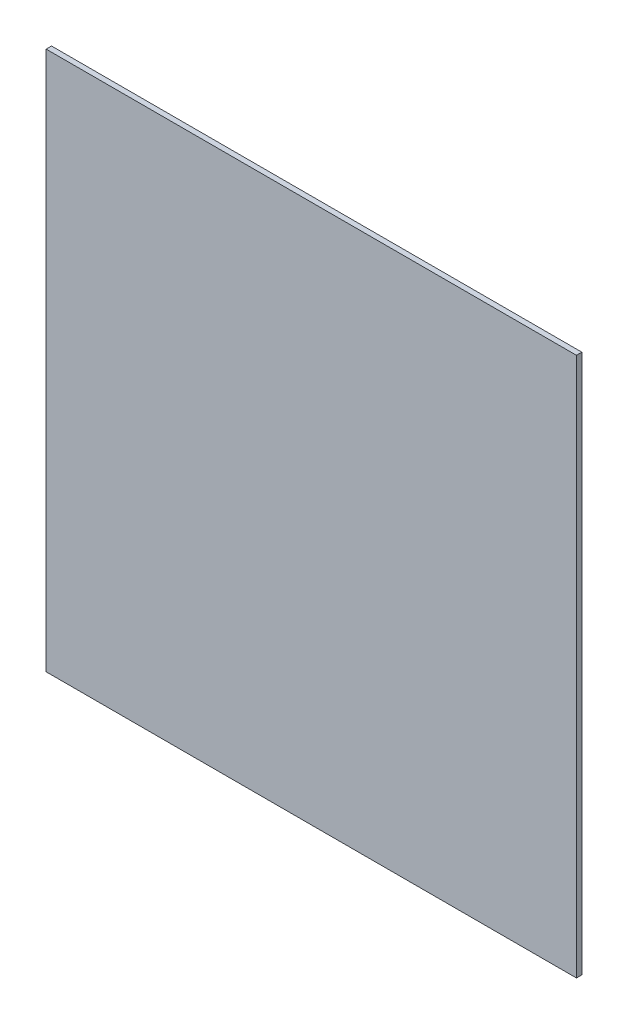
ISO-10303-21;
HEADER;
FILE_DESCRIPTION(('STEP AP214'),'2;1');
FILE_NAME('part.step','',(''),(''),'','','');
FILE_SCHEMA(('AUTOMOTIVE_DESIGN { 1 0 10303 214 1 1 1 1 }'));
ENDSEC;
DATA;
#1=APPLICATION_CONTEXT('core data for automotive mechanical design processes');
#2=APPLICATION_PROTOCOL_DEFINITION('international standard','automotive_design',2000,#1);
#3=PRODUCT_CONTEXT('',#1,'mechanical');
#4=PRODUCT('Part','Part','',(#3));
#5=PRODUCT_RELATED_PRODUCT_CATEGORY('part','',(#4));
#6=PRODUCT_DEFINITION_FORMATION('','',#4);
#7=PRODUCT_DEFINITION_CONTEXT('part definition',#1,'design');
#8=PRODUCT_DEFINITION('design','',#6,#7);
#9=PRODUCT_DEFINITION_SHAPE('','',#8);
#10=(LENGTH_UNIT() NAMED_UNIT(*) SI_UNIT(.MILLI.,.METRE.));
#11=(NAMED_UNIT(*) PLANE_ANGLE_UNIT() SI_UNIT($,.RADIAN.));
#12=(NAMED_UNIT(*) SI_UNIT($,.STERADIAN.) SOLID_ANGLE_UNIT());
#13=UNCERTAINTY_MEASURE_WITH_UNIT(LENGTH_MEASURE(1.E-05),#10,'distance_accuracy_value','');
#14=(GEOMETRIC_REPRESENTATION_CONTEXT(3) GLOBAL_UNCERTAINTY_ASSIGNED_CONTEXT((#13)) GLOBAL_UNIT_ASSIGNED_CONTEXT((#10,
#11,#12)) REPRESENTATION_CONTEXT('',''));
#15=CARTESIAN_POINT('',(0.,0.,0.));
#16=DIRECTION('',(0.,0.,1.));
#17=DIRECTION('',(1.,0.,0.));
#18=AXIS2_PLACEMENT_3D('',#15,#16,#17);
#19=CARTESIAN_POINT('',(0.,0.,6.));
#20=DIRECTION('',(1.,0.,0.));
#21=DIRECTION('',(0.,0.,-1.));
#22=AXIS2_PLACEMENT_3D('',#19,#20,#21);
#23=PLANE('',#22);
#24=DIRECTION('',(0.,-1.,0.));
#25=VECTOR('',#24,1.);
#26=CARTESIAN_POINT('',(0.,0.,0.));
#27=LINE('',#26,#25);
#28=CARTESIAN_POINT('',(0.,600.,0.));
#29=VERTEX_POINT('',#28);
#30=CARTESIAN_POINT('',(0.,0.,0.));
#31=VERTEX_POINT('',#30);
#32=EDGE_CURVE('E99',#29,#31,#27,.T.);
#33=ORIENTED_EDGE('',*,*,#32,.T.);
#34=DIRECTION('',(0.,0.,-1.));
#35=VECTOR('',#34,1.);
#36=CARTESIAN_POINT('',(0.,0.,6.));
#37=LINE('',#36,#35);
#38=CARTESIAN_POINT('',(0.,0.,6.));
#39=VERTEX_POINT('',#38);
#40=EDGE_CURVE('E11',#39,#31,#37,.T.);
#41=ORIENTED_EDGE('',*,*,#40,.F.);
#42=DIRECTION('',(0.,-1.,0.));
#43=VECTOR('',#42,1.);
#44=CARTESIAN_POINT('',(0.,0.,6.));
#45=LINE('',#44,#43);
#46=CARTESIAN_POINT('',(0.,600.,6.));
#47=VERTEX_POINT('',#46);
#48=EDGE_CURVE('E87',#47,#39,#45,.T.);
#49=ORIENTED_EDGE('',*,*,#48,.F.);
#50=DIRECTION('',(0.,0.,-1.));
#51=VECTOR('',#50,1.);
#52=CARTESIAN_POINT('',(0.,600.,6.));
#53=LINE('',#52,#51);
#54=EDGE_CURVE('E95',#47,#29,#53,.T.);
#55=ORIENTED_EDGE('',*,*,#54,.T.);
#56=EDGE_LOOP('',(#33,#41,#49,#55));
#57=FACE_BOUND('',#56,.T.);
#58=ADVANCED_FACE('F36',(#57),#23,.F.);
#59=CARTESIAN_POINT('',(0.,0.,6.));
#60=DIRECTION('',(0.,1.,0.));
#61=DIRECTION('',(0.,0.,1.));
#62=AXIS2_PLACEMENT_3D('',#59,#60,#61);
#63=PLANE('',#62);
#64=DIRECTION('',(1.,0.,0.));
#65=VECTOR('',#64,1.);
#66=CARTESIAN_POINT('',(0.,0.,0.));
#67=LINE('',#66,#65);
#68=CARTESIAN_POINT('',(590.,0.,0.));
#69=VERTEX_POINT('',#68);
#70=EDGE_CURVE('E91',#31,#69,#67,.T.);
#71=ORIENTED_EDGE('',*,*,#70,.T.);
#72=DIRECTION('',(0.,0.,-1.));
#73=VECTOR('',#72,1.);
#74=CARTESIAN_POINT('',(590.,0.,6.));
#75=LINE('',#74,#73);
#76=CARTESIAN_POINT('',(590.,0.,6.));
#77=VERTEX_POINT('',#76);
#78=EDGE_CURVE('E44',#77,#69,#75,.T.);
#79=ORIENTED_EDGE('',*,*,#78,.F.);
#80=DIRECTION('',(1.,0.,0.));
#81=VECTOR('',#80,1.);
#82=CARTESIAN_POINT('',(0.,0.,6.));
#83=LINE('',#82,#81);
#84=EDGE_CURVE('E82',#39,#77,#83,.T.);
#85=ORIENTED_EDGE('',*,*,#84,.F.);
#86=ORIENTED_EDGE('',*,*,#40,.T.);
#87=EDGE_LOOP('',(#71,#79,#85,#86));
#88=FACE_BOUND('',#87,.T.);
#89=ADVANCED_FACE('F90',(#88),#63,.F.);
#90=CARTESIAN_POINT('',(590.,0.,6.));
#91=DIRECTION('',(-1.,0.,0.));
#92=DIRECTION('',(0.,0.,1.));
#93=AXIS2_PLACEMENT_3D('',#90,#91,#92);
#94=PLANE('',#93);
#95=DIRECTION('',(0.,1.,0.));
#96=VECTOR('',#95,1.);
#97=CARTESIAN_POINT('',(590.,0.,0.));
#98=LINE('',#97,#96);
#99=CARTESIAN_POINT('',(590.,600.,0.));
#100=VERTEX_POINT('',#99);
#101=EDGE_CURVE('E69',#69,#100,#98,.T.);
#102=ORIENTED_EDGE('',*,*,#101,.T.);
#103=DIRECTION('',(0.,0.,-1.));
#104=VECTOR('',#103,1.);
#105=CARTESIAN_POINT('',(590.,600.,6.));
#106=LINE('',#105,#104);
#107=CARTESIAN_POINT('',(590.,600.,6.));
#108=VERTEX_POINT('',#107);
#109=EDGE_CURVE('E92',#108,#100,#106,.T.);
#110=ORIENTED_EDGE('',*,*,#109,.F.);
#111=DIRECTION('',(0.,1.,0.));
#112=VECTOR('',#111,1.);
#113=CARTESIAN_POINT('',(590.,0.,6.));
#114=LINE('',#113,#112);
#115=EDGE_CURVE('E85',#77,#108,#114,.T.);
#116=ORIENTED_EDGE('',*,*,#115,.F.);
#117=ORIENTED_EDGE('',*,*,#78,.T.);
#118=EDGE_LOOP('',(#102,#110,#116,#117));
#119=FACE_BOUND('',#118,.T.);
#120=ADVANCED_FACE('F93',(#119),#94,.F.);
#121=CARTESIAN_POINT('',(0.,600.,6.));
#122=DIRECTION('',(0.,-1.,0.));
#123=DIRECTION('',(0.,0.,-1.));
#124=AXIS2_PLACEMENT_3D('',#121,#122,#123);
#125=PLANE('',#124);
#126=DIRECTION('',(-1.,0.,0.));
#127=VECTOR('',#126,1.);
#128=CARTESIAN_POINT('',(0.,600.,0.));
#129=LINE('',#128,#127);
#130=EDGE_CURVE('E75',#100,#29,#129,.T.);
#131=ORIENTED_EDGE('',*,*,#130,.T.);
#132=ORIENTED_EDGE('',*,*,#54,.F.);
#133=DIRECTION('',(-1.,0.,0.));
#134=VECTOR('',#133,1.);
#135=CARTESIAN_POINT('',(0.,600.,6.));
#136=LINE('',#135,#134);
#137=EDGE_CURVE('E52',#108,#47,#136,.T.);
#138=ORIENTED_EDGE('',*,*,#137,.F.);
#139=ORIENTED_EDGE('',*,*,#109,.T.);
#140=EDGE_LOOP('',(#131,#132,#138,#139));
#141=FACE_BOUND('',#140,.T.);
#142=ADVANCED_FACE('F106',(#141),#125,.F.);
#143=CARTESIAN_POINT('',(0.,0.,6.));
#144=DIRECTION('',(0.,0.,-1.));
#145=DIRECTION('',(-1.,0.,0.));
#146=AXIS2_PLACEMENT_3D('',#143,#144,#145);
#147=PLANE('',#146);
#148=ORIENTED_EDGE('',*,*,#48,.T.);
#149=ORIENTED_EDGE('',*,*,#84,.T.);
#150=ORIENTED_EDGE('',*,*,#115,.T.);
#151=ORIENTED_EDGE('',*,*,#137,.T.);
#152=EDGE_LOOP('',(#148,#149,#150,#151));
#153=FACE_BOUND('',#152,.T.);
#154=ADVANCED_FACE('F83',(#153),#147,.F.);
#155=CARTESIAN_POINT('',(0.,0.,0.));
#156=DIRECTION('',(0.,0.,-1.));
#157=DIRECTION('',(-1.,0.,0.));
#158=AXIS2_PLACEMENT_3D('',#155,#156,#157);
#159=PLANE('',#158);
#160=ORIENTED_EDGE('',*,*,#32,.F.);
#161=ORIENTED_EDGE('',*,*,#130,.F.);
#162=ORIENTED_EDGE('',*,*,#101,.F.);
#163=ORIENTED_EDGE('',*,*,#70,.F.);
#164=EDGE_LOOP('',(#160,#161,#162,#163));
#165=FACE_BOUND('',#164,.T.);
#166=ADVANCED_FACE('F109',(#165),#159,.T.);
#167=CLOSED_SHELL('',(#58,#89,#120,#142,#154,#166));
#168=MANIFOLD_SOLID_BREP('B2',#167);
#169=ADVANCED_BREP_SHAPE_REPRESENTATION('',(#18,#168),#14);
#170=SHAPE_DEFINITION_REPRESENTATION(#9,#169);
ENDSEC;
END-ISO-10303-21;
